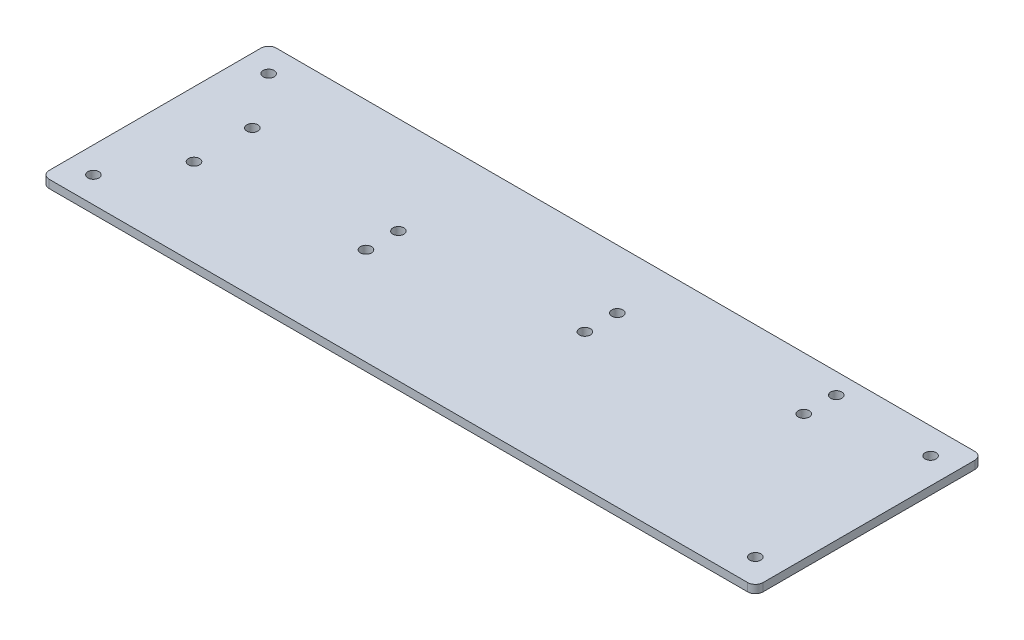
ISO-10303-21;
HEADER;
FILE_DESCRIPTION(('STEP AP214'),'2;1');
FILE_NAME('part.step','',(''),(''),'','','');
FILE_SCHEMA(('AUTOMOTIVE_DESIGN { 1 0 10303 214 1 1 1 1 }'));
ENDSEC;
DATA;
#1=APPLICATION_CONTEXT('core data for automotive mechanical design processes');
#2=APPLICATION_PROTOCOL_DEFINITION('international standard','automotive_design',2000,#1);
#3=PRODUCT_CONTEXT('',#1,'mechanical');
#4=PRODUCT('Part','Part','',(#3));
#5=PRODUCT_RELATED_PRODUCT_CATEGORY('part','',(#4));
#6=PRODUCT_DEFINITION_FORMATION('','',#4);
#7=PRODUCT_DEFINITION_CONTEXT('part definition',#1,'design');
#8=PRODUCT_DEFINITION('design','',#6,#7);
#9=PRODUCT_DEFINITION_SHAPE('','',#8);
#10=(LENGTH_UNIT() NAMED_UNIT(*) SI_UNIT(.MILLI.,.METRE.));
#11=(NAMED_UNIT(*) PLANE_ANGLE_UNIT() SI_UNIT($,.RADIAN.));
#12=(NAMED_UNIT(*) SI_UNIT($,.STERADIAN.) SOLID_ANGLE_UNIT());
#13=UNCERTAINTY_MEASURE_WITH_UNIT(LENGTH_MEASURE(1.E-05),#10,'distance_accuracy_value','');
#14=(GEOMETRIC_REPRESENTATION_CONTEXT(3) GLOBAL_UNCERTAINTY_ASSIGNED_CONTEXT((#13)) GLOBAL_UNIT_ASSIGNED_CONTEXT((#10,
#11,#12)) REPRESENTATION_CONTEXT('',''));
#15=CARTESIAN_POINT('',(0.,0.,0.));
#16=DIRECTION('',(0.,0.,1.));
#17=DIRECTION('',(1.,0.,0.));
#18=AXIS2_PLACEMENT_3D('',#15,#16,#17);
#19=CARTESIAN_POINT('',(139.7,3.175,-44.45));
#20=DIRECTION('',(-1.,0.,0.));
#21=DIRECTION('',(0.,0.,1.));
#22=AXIS2_PLACEMENT_3D('',#19,#20,#21);
#23=PLANE('',#22);
#24=DIRECTION('',(0.,0.,-1.));
#25=VECTOR('',#24,1.);
#26=CARTESIAN_POINT('',(139.7,3.175,-44.45));
#27=LINE('',#26,#25);
#28=CARTESIAN_POINT('',(139.7,3.175,41.45));
#29=VERTEX_POINT('',#28);
#30=CARTESIAN_POINT('',(139.7,3.175,-41.45));
#31=VERTEX_POINT('',#30);
#32=EDGE_CURVE('E130',#29,#31,#27,.T.);
#33=ORIENTED_EDGE('',*,*,#32,.F.);
#34=DIRECTION('',(0.,-1.,0.));
#35=VECTOR('',#34,1.);
#36=CARTESIAN_POINT('',(139.7,3.175,41.45));
#37=LINE('',#36,#35);
#38=CARTESIAN_POINT('',(139.7,0.,41.45));
#39=VERTEX_POINT('',#38);
#40=EDGE_CURVE('E11',#29,#39,#37,.T.);
#41=ORIENTED_EDGE('',*,*,#40,.T.);
#42=DIRECTION('',(0.,0.,-1.));
#43=VECTOR('',#42,1.);
#44=CARTESIAN_POINT('',(139.7,0.,-44.45));
#45=LINE('',#44,#43);
#46=CARTESIAN_POINT('',(139.7,0.,-41.45));
#47=VERTEX_POINT('',#46);
#48=EDGE_CURVE('E132',#39,#47,#45,.T.);
#49=ORIENTED_EDGE('',*,*,#48,.T.);
#50=DIRECTION('',(0.,-1.,0.));
#51=VECTOR('',#50,1.);
#52=CARTESIAN_POINT('',(139.7,3.175,-41.45));
#53=LINE('',#52,#51);
#54=EDGE_CURVE('E43',#47,#31,#53,.F.);
#55=ORIENTED_EDGE('',*,*,#54,.T.);
#56=EDGE_LOOP('',(#33,#41,#49,#55));
#57=FACE_BOUND('',#56,.T.);
#58=ADVANCED_FACE('F35',(#57),#23,.F.);
#59=CARTESIAN_POINT('',(-139.7,3.175,-44.45));
#60=DIRECTION('',(0.,0.,1.));
#61=DIRECTION('',(1.,0.,0.));
#62=AXIS2_PLACEMENT_3D('',#59,#60,#61);
#63=PLANE('',#62);
#64=DIRECTION('',(-1.,0.,0.));
#65=VECTOR('',#64,1.);
#66=CARTESIAN_POINT('',(-139.7,0.,-44.45));
#67=LINE('',#66,#65);
#68=CARTESIAN_POINT('',(136.7,0.,-44.45));
#69=VERTEX_POINT('',#68);
#70=CARTESIAN_POINT('',(-136.7,0.,-44.45));
#71=VERTEX_POINT('',#70);
#72=EDGE_CURVE('E128',#69,#71,#67,.T.);
#73=ORIENTED_EDGE('',*,*,#72,.T.);
#74=DIRECTION('',(0.,-1.,0.));
#75=VECTOR('',#74,1.);
#76=CARTESIAN_POINT('',(-136.7,3.175,-44.45));
#77=LINE('',#76,#75);
#78=CARTESIAN_POINT('',(-136.7,3.175,-44.45));
#79=VERTEX_POINT('',#78);
#80=EDGE_CURVE('E107',#71,#79,#77,.F.);
#81=ORIENTED_EDGE('',*,*,#80,.T.);
#82=DIRECTION('',(-1.,0.,0.));
#83=VECTOR('',#82,1.);
#84=CARTESIAN_POINT('',(-139.7,3.175,-44.45));
#85=LINE('',#84,#83);
#86=CARTESIAN_POINT('',(136.7,3.175,-44.45));
#87=VERTEX_POINT('',#86);
#88=EDGE_CURVE('E216',#87,#79,#85,.T.);
#89=ORIENTED_EDGE('',*,*,#88,.F.);
#90=DIRECTION('',(0.,-1.,0.));
#91=VECTOR('',#90,1.);
#92=CARTESIAN_POINT('',(136.7,3.175,-44.45));
#93=LINE('',#92,#91);
#94=EDGE_CURVE('E112',#87,#69,#93,.T.);
#95=ORIENTED_EDGE('',*,*,#94,.T.);
#96=EDGE_LOOP('',(#73,#81,#89,#95));
#97=FACE_BOUND('',#96,.T.);
#98=ADVANCED_FACE('F220',(#97),#63,.F.);
#99=CARTESIAN_POINT('',(-139.7,3.175,-44.45));
#100=DIRECTION('',(1.,0.,0.));
#101=DIRECTION('',(0.,0.,-1.));
#102=AXIS2_PLACEMENT_3D('',#99,#100,#101);
#103=PLANE('',#102);
#104=DIRECTION('',(0.,0.,1.));
#105=VECTOR('',#104,1.);
#106=CARTESIAN_POINT('',(-139.7,3.175,-44.45));
#107=LINE('',#106,#105);
#108=CARTESIAN_POINT('',(-139.7,3.175,-41.45));
#109=VERTEX_POINT('',#108);
#110=CARTESIAN_POINT('',(-139.7,3.175,41.45));
#111=VERTEX_POINT('',#110);
#112=EDGE_CURVE('E121',#109,#111,#107,.T.);
#113=ORIENTED_EDGE('',*,*,#112,.F.);
#114=DIRECTION('',(0.,-1.,0.));
#115=VECTOR('',#114,1.);
#116=CARTESIAN_POINT('',(-139.7,3.175,-41.45));
#117=LINE('',#116,#115);
#118=CARTESIAN_POINT('',(-139.7,0.,-41.45));
#119=VERTEX_POINT('',#118);
#120=EDGE_CURVE('E106',#109,#119,#117,.T.);
#121=ORIENTED_EDGE('',*,*,#120,.T.);
#122=DIRECTION('',(0.,0.,1.));
#123=VECTOR('',#122,1.);
#124=CARTESIAN_POINT('',(-139.7,0.,-44.45));
#125=LINE('',#124,#123);
#126=CARTESIAN_POINT('',(-139.7,0.,41.45));
#127=VERTEX_POINT('',#126);
#128=EDGE_CURVE('E119',#119,#127,#125,.T.);
#129=ORIENTED_EDGE('',*,*,#128,.T.);
#130=DIRECTION('',(0.,-1.,0.));
#131=VECTOR('',#130,1.);
#132=CARTESIAN_POINT('',(-139.7,3.175,41.45));
#133=LINE('',#132,#131);
#134=EDGE_CURVE('E123',#127,#111,#133,.F.);
#135=ORIENTED_EDGE('',*,*,#134,.T.);
#136=EDGE_LOOP('',(#113,#121,#129,#135));
#137=FACE_BOUND('',#136,.T.);
#138=ADVANCED_FACE('F118',(#137),#103,.F.);
#139=CARTESIAN_POINT('',(-139.7,3.175,44.45));
#140=DIRECTION('',(0.,0.,-1.));
#141=DIRECTION('',(-1.,0.,0.));
#142=AXIS2_PLACEMENT_3D('',#139,#140,#141);
#143=PLANE('',#142);
#144=DIRECTION('',(1.,0.,0.));
#145=VECTOR('',#144,1.);
#146=CARTESIAN_POINT('',(-139.7,3.175,44.45));
#147=LINE('',#146,#145);
#148=CARTESIAN_POINT('',(-136.7,3.175,44.45));
#149=VERTEX_POINT('',#148);
#150=CARTESIAN_POINT('',(136.7,3.175,44.45));
#151=VERTEX_POINT('',#150);
#152=EDGE_CURVE('E184',#149,#151,#147,.T.);
#153=ORIENTED_EDGE('',*,*,#152,.F.);
#154=DIRECTION('',(0.,-1.,0.));
#155=VECTOR('',#154,1.);
#156=CARTESIAN_POINT('',(-136.7,3.175,44.45));
#157=LINE('',#156,#155);
#158=CARTESIAN_POINT('',(-136.7,0.,44.45));
#159=VERTEX_POINT('',#158);
#160=EDGE_CURVE('E201',#149,#159,#157,.T.);
#161=ORIENTED_EDGE('',*,*,#160,.T.);
#162=DIRECTION('',(1.,0.,0.));
#163=VECTOR('',#162,1.);
#164=CARTESIAN_POINT('',(-139.7,0.,44.45));
#165=LINE('',#164,#163);
#166=CARTESIAN_POINT('',(136.7,0.,44.45));
#167=VERTEX_POINT('',#166);
#168=EDGE_CURVE('E127',#159,#167,#165,.T.);
#169=ORIENTED_EDGE('',*,*,#168,.T.);
#170=DIRECTION('',(0.,-1.,0.));
#171=VECTOR('',#170,1.);
#172=CARTESIAN_POINT('',(136.7,3.175,44.45));
#173=LINE('',#172,#171);
#174=EDGE_CURVE('E50',#167,#151,#173,.F.);
#175=ORIENTED_EDGE('',*,*,#174,.T.);
#176=EDGE_LOOP('',(#153,#161,#169,#175));
#177=FACE_BOUND('',#176,.T.);
#178=ADVANCED_FACE('F255',(#177),#143,.F.);
#179=CARTESIAN_POINT('',(0.,3.175,0.));
#180=DIRECTION('',(0.,1.,0.));
#181=DIRECTION('',(0.,0.,1.));
#182=AXIS2_PLACEMENT_3D('',#179,#180,#181);
#183=PLANE('',#182);
#184=CARTESIAN_POINT('',(129.54,3.175,-34.29));
#185=DIRECTION('',(0.,1.,0.));
#186=DIRECTION('',(0.,0.,-1.));
#187=AXIS2_PLACEMENT_3D('',#184,#185,#186);
#188=CIRCLE('',#187,2.15899999999999);
#189=CARTESIAN_POINT('',(129.54,3.175,-36.449));
#190=VERTEX_POINT('',#189);
#191=EDGE_CURVE('E183',#190,#190,#188,.T.);
#192=ORIENTED_EDGE('',*,*,#191,.F.);
#193=EDGE_LOOP('',(#192));
#194=FACE_BOUND('',#193,.T.);
#195=CARTESIAN_POINT('',(-129.54,3.175,-34.29));
#196=DIRECTION('',(0.,1.,0.));
#197=DIRECTION('',(0.,0.,1.));
#198=AXIS2_PLACEMENT_3D('',#195,#196,#197);
#199=CIRCLE('',#198,2.15899999999999);
#200=CARTESIAN_POINT('',(-129.54,3.175,-32.131));
#201=VERTEX_POINT('',#200);
#202=EDGE_CURVE('E179',#201,#201,#199,.T.);
#203=ORIENTED_EDGE('',*,*,#202,.F.);
#204=EDGE_LOOP('',(#203));
#205=FACE_BOUND('',#204,.T.);
#206=CARTESIAN_POINT('',(-129.54,3.175,34.29));
#207=DIRECTION('',(0.,1.,0.));
#208=DIRECTION('',(0.,0.,-1.));
#209=AXIS2_PLACEMENT_3D('',#206,#207,#208);
#210=CIRCLE('',#209,2.15899999999999);
#211=CARTESIAN_POINT('',(-129.54,3.175,32.131));
#212=VERTEX_POINT('',#211);
#213=EDGE_CURVE('E175',#212,#212,#210,.T.);
#214=ORIENTED_EDGE('',*,*,#213,.F.);
#215=EDGE_LOOP('',(#214));
#216=FACE_BOUND('',#215,.T.);
#217=CARTESIAN_POINT('',(129.54,3.175,34.29));
#218=DIRECTION('',(0.,1.,0.));
#219=DIRECTION('',(0.,0.,1.));
#220=AXIS2_PLACEMENT_3D('',#217,#218,#219);
#221=CIRCLE('',#220,2.15899999999999);
#222=CARTESIAN_POINT('',(129.54,3.175,36.449));
#223=VERTEX_POINT('',#222);
#224=EDGE_CURVE('E171',#223,#223,#221,.T.);
#225=ORIENTED_EDGE('',*,*,#224,.F.);
#226=EDGE_LOOP('',(#225));
#227=FACE_BOUND('',#226,.T.);
#228=CARTESIAN_POINT('',(90.5032024020057,3.175,-23.6849228555336));
#229=DIRECTION('',(0.,1.,0.));
#230=DIRECTION('',(0.,0.,1.));
#231=AXIS2_PLACEMENT_3D('',#228,#229,#230);
#232=CIRCLE('',#231,2.15899999999999);
#233=CARTESIAN_POINT('',(90.5032024020057,3.175,-21.5259228555336));
#234=VERTEX_POINT('',#233);
#235=EDGE_CURVE('E167',#234,#234,#232,.T.);
#236=ORIENTED_EDGE('',*,*,#235,.F.);
#237=EDGE_LOOP('',(#236));
#238=FACE_BOUND('',#237,.T.);
#239=CARTESIAN_POINT('',(90.5032024020056,3.175,-36.3849228555336));
#240=DIRECTION('',(0.,1.,0.));
#241=DIRECTION('',(0.,0.,1.));
#242=AXIS2_PLACEMENT_3D('',#239,#240,#241);
#243=CIRCLE('',#242,2.15899999999998);
#244=CARTESIAN_POINT('',(90.5032024020056,3.175,-34.2259228555336));
#245=VERTEX_POINT('',#244);
#246=EDGE_CURVE('E163',#245,#245,#243,.T.);
#247=ORIENTED_EDGE('',*,*,#246,.F.);
#248=EDGE_LOOP('',(#247));
#249=FACE_BOUND('',#248,.T.);
#250=CARTESIAN_POINT('',(19.8516012010029,3.175,-8.66746142776678));
#251=DIRECTION('',(0.,1.,0.));
#252=DIRECTION('',(0.,0.,1.));
#253=AXIS2_PLACEMENT_3D('',#250,#251,#252);
#254=CIRCLE('',#253,2.159);
#255=CARTESIAN_POINT('',(19.8516012010029,3.175,-6.50846142776678));
#256=VERTEX_POINT('',#255);
#257=EDGE_CURVE('E159',#256,#256,#254,.T.);
#258=ORIENTED_EDGE('',*,*,#257,.F.);
#259=EDGE_LOOP('',(#258));
#260=FACE_BOUND('',#259,.T.);
#261=CARTESIAN_POINT('',(19.8516012010028,3.175,-21.3674614277668));
#262=DIRECTION('',(0.,1.,0.));
#263=DIRECTION('',(0.,0.,1.));
#264=AXIS2_PLACEMENT_3D('',#261,#262,#263);
#265=CIRCLE('',#264,2.159);
#266=CARTESIAN_POINT('',(19.8516012010028,3.175,-19.2084614277668));
#267=VERTEX_POINT('',#266);
#268=EDGE_CURVE('E155',#267,#267,#265,.T.);
#269=ORIENTED_EDGE('',*,*,#268,.F.);
#270=EDGE_LOOP('',(#269));
#271=FACE_BOUND('',#270,.T.);
#272=CARTESIAN_POINT('',(-50.7999999999998,3.175,6.35));
#273=DIRECTION('',(0.,1.,0.));
#274=DIRECTION('',(0.,0.,1.));
#275=AXIS2_PLACEMENT_3D('',#272,#273,#274);
#276=CIRCLE('',#275,2.15899999999999);
#277=CARTESIAN_POINT('',(-50.7999999999998,3.175,8.509));
#278=VERTEX_POINT('',#277);
#279=EDGE_CURVE('E151',#278,#278,#276,.T.);
#280=ORIENTED_EDGE('',*,*,#279,.F.);
#281=EDGE_LOOP('',(#280));
#282=FACE_BOUND('',#281,.T.);
#283=CARTESIAN_POINT('',(-50.8,3.175,-6.35));
#284=DIRECTION('',(0.,1.,0.));
#285=DIRECTION('',(0.,0.,1.));
#286=AXIS2_PLACEMENT_3D('',#283,#284,#285);
#287=CIRCLE('',#286,2.159);
#288=CARTESIAN_POINT('',(-50.8,3.175,-4.191));
#289=VERTEX_POINT('',#288);
#290=EDGE_CURVE('E147',#289,#289,#287,.T.);
#291=ORIENTED_EDGE('',*,*,#290,.F.);
#292=EDGE_LOOP('',(#291));
#293=FACE_BOUND('',#292,.T.);
#294=CARTESIAN_POINT('',(-114.3,3.175,10.16));
#295=DIRECTION('',(0.,1.,0.));
#296=DIRECTION('',(0.,0.,1.));
#297=AXIS2_PLACEMENT_3D('',#294,#295,#296);
#298=CIRCLE('',#297,2.16000000000001);
#299=CARTESIAN_POINT('',(-114.3,3.175,12.32));
#300=VERTEX_POINT('',#299);
#301=EDGE_CURVE('E143',#300,#300,#298,.T.);
#302=ORIENTED_EDGE('',*,*,#301,.F.);
#303=EDGE_LOOP('',(#302));
#304=FACE_BOUND('',#303,.T.);
#305=CARTESIAN_POINT('',(-114.3,3.175,-12.7));
#306=DIRECTION('',(0.,1.,0.));
#307=DIRECTION('',(0.,0.,1.));
#308=AXIS2_PLACEMENT_3D('',#305,#306,#307);
#309=CIRCLE('',#308,2.16000000000001);
#310=CARTESIAN_POINT('',(-114.3,3.175,-10.54));
#311=VERTEX_POINT('',#310);
#312=EDGE_CURVE('E139',#311,#311,#309,.T.);
#313=ORIENTED_EDGE('',*,*,#312,.F.);
#314=EDGE_LOOP('',(#313));
#315=FACE_BOUND('',#314,.T.);
#316=ORIENTED_EDGE('',*,*,#88,.T.);
#317=CARTESIAN_POINT('',(-136.7,3.175,-41.45));
#318=DIRECTION('',(0.,1.,0.));
#319=DIRECTION('',(0.,0.,1.));
#320=AXIS2_PLACEMENT_3D('',#317,#318,#319);
#321=CIRCLE('',#320,3.);
#322=EDGE_CURVE('E198',#79,#109,#321,.T.);
#323=ORIENTED_EDGE('',*,*,#322,.T.);
#324=ORIENTED_EDGE('',*,*,#112,.T.);
#325=CARTESIAN_POINT('',(-136.7,3.175,41.45));
#326=DIRECTION('',(0.,1.,0.));
#327=DIRECTION('',(0.,0.,1.));
#328=AXIS2_PLACEMENT_3D('',#325,#326,#327);
#329=CIRCLE('',#328,3.);
#330=EDGE_CURVE('E57',#111,#149,#329,.T.);
#331=ORIENTED_EDGE('',*,*,#330,.T.);
#332=ORIENTED_EDGE('',*,*,#152,.T.);
#333=CARTESIAN_POINT('',(136.7,3.175,41.45));
#334=DIRECTION('',(0.,1.,0.));
#335=DIRECTION('',(0.,0.,1.));
#336=AXIS2_PLACEMENT_3D('',#333,#334,#335);
#337=CIRCLE('',#336,3.);
#338=EDGE_CURVE('E195',#151,#29,#337,.T.);
#339=ORIENTED_EDGE('',*,*,#338,.T.);
#340=ORIENTED_EDGE('',*,*,#32,.T.);
#341=CARTESIAN_POINT('',(136.7,3.175,-41.45));
#342=DIRECTION('',(0.,1.,0.));
#343=DIRECTION('',(0.,0.,1.));
#344=AXIS2_PLACEMENT_3D('',#341,#342,#343);
#345=CIRCLE('',#344,3.);
#346=EDGE_CURVE('E193',#31,#87,#345,.T.);
#347=ORIENTED_EDGE('',*,*,#346,.T.);
#348=EDGE_LOOP('',(#316,#323,#324,#331,#332,#339,#340,#347));
#349=FACE_BOUND('',#348,.T.);
#350=ADVANCED_FACE('F213',(#194,#205,#216,#227,#238,#249,#260,#271,#282,#293,#304,#315,#349),
#183,.T.);
#351=CARTESIAN_POINT('',(0.,0.,0.));
#352=DIRECTION('',(0.,1.,0.));
#353=DIRECTION('',(0.,0.,1.));
#354=AXIS2_PLACEMENT_3D('',#351,#352,#353);
#355=PLANE('',#354);
#356=CARTESIAN_POINT('',(129.54,0.,-34.29));
#357=DIRECTION('',(0.,1.,0.));
#358=DIRECTION('',(0.,0.,1.));
#359=AXIS2_PLACEMENT_3D('',#356,#357,#358);
#360=CIRCLE('',#359,2.15899999999999);
#361=CARTESIAN_POINT('',(129.54,0.,-32.131));
#362=VERTEX_POINT('',#361);
#363=EDGE_CURVE('E180',#362,#362,#360,.T.);
#364=ORIENTED_EDGE('',*,*,#363,.T.);
#365=EDGE_LOOP('',(#364));
#366=FACE_BOUND('',#365,.T.);
#367=CARTESIAN_POINT('',(-129.54,0.,-34.29));
#368=DIRECTION('',(0.,1.,0.));
#369=DIRECTION('',(0.,0.,1.));
#370=AXIS2_PLACEMENT_3D('',#367,#368,#369);
#371=CIRCLE('',#370,2.15899999999999);
#372=CARTESIAN_POINT('',(-129.54,0.,-32.131));
#373=VERTEX_POINT('',#372);
#374=EDGE_CURVE('E176',#373,#373,#371,.T.);
#375=ORIENTED_EDGE('',*,*,#374,.T.);
#376=EDGE_LOOP('',(#375));
#377=FACE_BOUND('',#376,.T.);
#378=CARTESIAN_POINT('',(-129.54,0.,34.29));
#379=DIRECTION('',(0.,1.,0.));
#380=DIRECTION('',(0.,0.,1.));
#381=AXIS2_PLACEMENT_3D('',#378,#379,#380);
#382=CIRCLE('',#381,2.15899999999999);
#383=CARTESIAN_POINT('',(-129.54,0.,36.449));
#384=VERTEX_POINT('',#383);
#385=EDGE_CURVE('E172',#384,#384,#382,.T.);
#386=ORIENTED_EDGE('',*,*,#385,.T.);
#387=EDGE_LOOP('',(#386));
#388=FACE_BOUND('',#387,.T.);
#389=CARTESIAN_POINT('',(129.54,0.,34.29));
#390=DIRECTION('',(0.,1.,0.));
#391=DIRECTION('',(0.,0.,1.));
#392=AXIS2_PLACEMENT_3D('',#389,#390,#391);
#393=CIRCLE('',#392,2.15899999999999);
#394=CARTESIAN_POINT('',(129.54,0.,36.449));
#395=VERTEX_POINT('',#394);
#396=EDGE_CURVE('E168',#395,#395,#393,.T.);
#397=ORIENTED_EDGE('',*,*,#396,.T.);
#398=EDGE_LOOP('',(#397));
#399=FACE_BOUND('',#398,.T.);
#400=CARTESIAN_POINT('',(90.5032024020057,0.,-23.6849228555336));
#401=DIRECTION('',(0.,1.,0.));
#402=DIRECTION('',(0.,0.,1.));
#403=AXIS2_PLACEMENT_3D('',#400,#401,#402);
#404=CIRCLE('',#403,2.15899999999999);
#405=CARTESIAN_POINT('',(90.5032024020057,0.,-21.5259228555336));
#406=VERTEX_POINT('',#405);
#407=EDGE_CURVE('E164',#406,#406,#404,.T.);
#408=ORIENTED_EDGE('',*,*,#407,.T.);
#409=EDGE_LOOP('',(#408));
#410=FACE_BOUND('',#409,.T.);
#411=CARTESIAN_POINT('',(90.5032024020056,0.,-36.3849228555336));
#412=DIRECTION('',(0.,1.,0.));
#413=DIRECTION('',(0.,0.,1.));
#414=AXIS2_PLACEMENT_3D('',#411,#412,#413);
#415=CIRCLE('',#414,2.15899999999998);
#416=CARTESIAN_POINT('',(90.5032024020056,0.,-34.2259228555336));
#417=VERTEX_POINT('',#416);
#418=EDGE_CURVE('E160',#417,#417,#415,.T.);
#419=ORIENTED_EDGE('',*,*,#418,.T.);
#420=EDGE_LOOP('',(#419));
#421=FACE_BOUND('',#420,.T.);
#422=CARTESIAN_POINT('',(19.8516012010029,0.,-8.66746142776678));
#423=DIRECTION('',(0.,1.,0.));
#424=DIRECTION('',(0.,0.,1.));
#425=AXIS2_PLACEMENT_3D('',#422,#423,#424);
#426=CIRCLE('',#425,2.159);
#427=CARTESIAN_POINT('',(19.8516012010029,0.,-6.50846142776678));
#428=VERTEX_POINT('',#427);
#429=EDGE_CURVE('E156',#428,#428,#426,.T.);
#430=ORIENTED_EDGE('',*,*,#429,.T.);
#431=EDGE_LOOP('',(#430));
#432=FACE_BOUND('',#431,.T.);
#433=CARTESIAN_POINT('',(19.8516012010028,0.,-21.3674614277668));
#434=DIRECTION('',(0.,1.,0.));
#435=DIRECTION('',(0.,0.,1.));
#436=AXIS2_PLACEMENT_3D('',#433,#434,#435);
#437=CIRCLE('',#436,2.159);
#438=CARTESIAN_POINT('',(19.8516012010028,0.,-19.2084614277668));
#439=VERTEX_POINT('',#438);
#440=EDGE_CURVE('E152',#439,#439,#437,.T.);
#441=ORIENTED_EDGE('',*,*,#440,.T.);
#442=EDGE_LOOP('',(#441));
#443=FACE_BOUND('',#442,.T.);
#444=CARTESIAN_POINT('',(-50.7999999999998,0.,6.35));
#445=DIRECTION('',(0.,1.,0.));
#446=DIRECTION('',(0.,0.,1.));
#447=AXIS2_PLACEMENT_3D('',#444,#445,#446);
#448=CIRCLE('',#447,2.15899999999999);
#449=CARTESIAN_POINT('',(-50.7999999999998,0.,8.509));
#450=VERTEX_POINT('',#449);
#451=EDGE_CURVE('E148',#450,#450,#448,.T.);
#452=ORIENTED_EDGE('',*,*,#451,.T.);
#453=EDGE_LOOP('',(#452));
#454=FACE_BOUND('',#453,.T.);
#455=CARTESIAN_POINT('',(-50.8,0.,-6.35));
#456=DIRECTION('',(0.,1.,0.));
#457=DIRECTION('',(0.,0.,1.));
#458=AXIS2_PLACEMENT_3D('',#455,#456,#457);
#459=CIRCLE('',#458,2.159);
#460=CARTESIAN_POINT('',(-50.8,0.,-4.191));
#461=VERTEX_POINT('',#460);
#462=EDGE_CURVE('E144',#461,#461,#459,.T.);
#463=ORIENTED_EDGE('',*,*,#462,.T.);
#464=EDGE_LOOP('',(#463));
#465=FACE_BOUND('',#464,.T.);
#466=CARTESIAN_POINT('',(-114.3,0.,10.16));
#467=DIRECTION('',(0.,1.,0.));
#468=DIRECTION('',(0.,0.,1.));
#469=AXIS2_PLACEMENT_3D('',#466,#467,#468);
#470=CIRCLE('',#469,2.16000000000001);
#471=CARTESIAN_POINT('',(-114.3,0.,12.32));
#472=VERTEX_POINT('',#471);
#473=EDGE_CURVE('E140',#472,#472,#470,.T.);
#474=ORIENTED_EDGE('',*,*,#473,.T.);
#475=EDGE_LOOP('',(#474));
#476=FACE_BOUND('',#475,.T.);
#477=CARTESIAN_POINT('',(-114.3,0.,-12.7));
#478=DIRECTION('',(0.,1.,0.));
#479=DIRECTION('',(0.,0.,1.));
#480=AXIS2_PLACEMENT_3D('',#477,#478,#479);
#481=CIRCLE('',#480,2.16000000000001);
#482=CARTESIAN_POINT('',(-114.3,0.,-10.54));
#483=VERTEX_POINT('',#482);
#484=EDGE_CURVE('E136',#483,#483,#481,.T.);
#485=ORIENTED_EDGE('',*,*,#484,.T.);
#486=EDGE_LOOP('',(#485));
#487=FACE_BOUND('',#486,.T.);
#488=ORIENTED_EDGE('',*,*,#128,.F.);
#489=CARTESIAN_POINT('',(-136.7,0.,-41.45));
#490=DIRECTION('',(0.,1.,0.));
#491=DIRECTION('',(0.,0.,1.));
#492=AXIS2_PLACEMENT_3D('',#489,#490,#491);
#493=CIRCLE('',#492,3.);
#494=EDGE_CURVE('E102',#119,#71,#493,.F.);
#495=ORIENTED_EDGE('',*,*,#494,.T.);
#496=ORIENTED_EDGE('',*,*,#72,.F.);
#497=CARTESIAN_POINT('',(136.7,0.,-41.45));
#498=DIRECTION('',(0.,1.,0.));
#499=DIRECTION('',(0.,0.,1.));
#500=AXIS2_PLACEMENT_3D('',#497,#498,#499);
#501=CIRCLE('',#500,3.);
#502=EDGE_CURVE('E122',#69,#47,#501,.F.);
#503=ORIENTED_EDGE('',*,*,#502,.T.);
#504=ORIENTED_EDGE('',*,*,#48,.F.);
#505=CARTESIAN_POINT('',(136.7,0.,41.45));
#506=DIRECTION('',(0.,1.,0.));
#507=DIRECTION('',(0.,0.,1.));
#508=AXIS2_PLACEMENT_3D('',#505,#506,#507);
#509=CIRCLE('',#508,3.);
#510=EDGE_CURVE('E187',#39,#167,#509,.F.);
#511=ORIENTED_EDGE('',*,*,#510,.T.);
#512=ORIENTED_EDGE('',*,*,#168,.F.);
#513=CARTESIAN_POINT('',(-136.7,0.,41.45));
#514=DIRECTION('',(0.,1.,0.));
#515=DIRECTION('',(0.,0.,1.));
#516=AXIS2_PLACEMENT_3D('',#513,#514,#515);
#517=CIRCLE('',#516,3.);
#518=EDGE_CURVE('E113',#159,#127,#517,.F.);
#519=ORIENTED_EDGE('',*,*,#518,.T.);
#520=EDGE_LOOP('',(#488,#495,#496,#503,#504,#511,#512,#519));
#521=FACE_BOUND('',#520,.T.);
#522=ADVANCED_FACE('F125',(#366,#377,#388,#399,#410,#421,#432,#443,#454,#465,#476,#487,#521),
#355,.F.);
#523=CARTESIAN_POINT('',(-114.3,-3.175,-12.7));
#524=DIRECTION('',(0.,1.,0.));
#525=DIRECTION('',(0.,0.,1.));
#526=AXIS2_PLACEMENT_3D('',#523,#524,#525);
#527=CYLINDRICAL_SURFACE('',#526,2.16000000000001);
#528=ORIENTED_EDGE('',*,*,#312,.T.);
#529=EDGE_LOOP('',(#528));
#530=FACE_BOUND('',#529,.T.);
#531=ORIENTED_EDGE('',*,*,#484,.F.);
#532=EDGE_LOOP('',(#531));
#533=FACE_BOUND('',#532,.T.);
#534=ADVANCED_FACE('F279',(#530,#533),#527,.F.);
#535=CARTESIAN_POINT('',(-114.3,-3.175,10.16));
#536=DIRECTION('',(0.,1.,0.));
#537=DIRECTION('',(0.,0.,1.));
#538=AXIS2_PLACEMENT_3D('',#535,#536,#537);
#539=CYLINDRICAL_SURFACE('',#538,2.16000000000001);
#540=ORIENTED_EDGE('',*,*,#301,.T.);
#541=EDGE_LOOP('',(#540));
#542=FACE_BOUND('',#541,.T.);
#543=ORIENTED_EDGE('',*,*,#473,.F.);
#544=EDGE_LOOP('',(#543));
#545=FACE_BOUND('',#544,.T.);
#546=ADVANCED_FACE('F282',(#542,#545),#539,.F.);
#547=CARTESIAN_POINT('',(-50.8,-3.175,-6.35));
#548=DIRECTION('',(0.,1.,0.));
#549=DIRECTION('',(0.,0.,1.));
#550=AXIS2_PLACEMENT_3D('',#547,#548,#549);
#551=CYLINDRICAL_SURFACE('',#550,2.159);
#552=ORIENTED_EDGE('',*,*,#290,.T.);
#553=EDGE_LOOP('',(#552));
#554=FACE_BOUND('',#553,.T.);
#555=ORIENTED_EDGE('',*,*,#462,.F.);
#556=EDGE_LOOP('',(#555));
#557=FACE_BOUND('',#556,.T.);
#558=ADVANCED_FACE('F453',(#554,#557),#551,.F.);
#559=CARTESIAN_POINT('',(-50.7999999999998,-3.175,6.35));
#560=DIRECTION('',(0.,1.,0.));
#561=DIRECTION('',(0.,0.,1.));
#562=AXIS2_PLACEMENT_3D('',#559,#560,#561);
#563=CYLINDRICAL_SURFACE('',#562,2.15899999999999);
#564=ORIENTED_EDGE('',*,*,#279,.T.);
#565=EDGE_LOOP('',(#564));
#566=FACE_BOUND('',#565,.T.);
#567=ORIENTED_EDGE('',*,*,#451,.F.);
#568=EDGE_LOOP('',(#567));
#569=FACE_BOUND('',#568,.T.);
#570=ADVANCED_FACE('F443',(#566,#569),#563,.F.);
#571=CARTESIAN_POINT('',(19.8516012010028,-3.175,-21.3674614277668));
#572=DIRECTION('',(0.,1.,0.));
#573=DIRECTION('',(0.,0.,1.));
#574=AXIS2_PLACEMENT_3D('',#571,#572,#573);
#575=CYLINDRICAL_SURFACE('',#574,2.159);
#576=ORIENTED_EDGE('',*,*,#268,.T.);
#577=EDGE_LOOP('',(#576));
#578=FACE_BOUND('',#577,.T.);
#579=ORIENTED_EDGE('',*,*,#440,.F.);
#580=EDGE_LOOP('',(#579));
#581=FACE_BOUND('',#580,.T.);
#582=ADVANCED_FACE('F433',(#578,#581),#575,.F.);
#583=CARTESIAN_POINT('',(19.8516012010029,-3.175,-8.66746142776678));
#584=DIRECTION('',(0.,1.,0.));
#585=DIRECTION('',(0.,0.,1.));
#586=AXIS2_PLACEMENT_3D('',#583,#584,#585);
#587=CYLINDRICAL_SURFACE('',#586,2.159);
#588=ORIENTED_EDGE('',*,*,#257,.T.);
#589=EDGE_LOOP('',(#588));
#590=FACE_BOUND('',#589,.T.);
#591=ORIENTED_EDGE('',*,*,#429,.F.);
#592=EDGE_LOOP('',(#591));
#593=FACE_BOUND('',#592,.T.);
#594=ADVANCED_FACE('F423',(#590,#593),#587,.F.);
#595=CARTESIAN_POINT('',(90.5032024020056,-3.175,-36.3849228555336));
#596=DIRECTION('',(0.,1.,0.));
#597=DIRECTION('',(0.,0.,1.));
#598=AXIS2_PLACEMENT_3D('',#595,#596,#597);
#599=CYLINDRICAL_SURFACE('',#598,2.15899999999998);
#600=ORIENTED_EDGE('',*,*,#246,.T.);
#601=EDGE_LOOP('',(#600));
#602=FACE_BOUND('',#601,.T.);
#603=ORIENTED_EDGE('',*,*,#418,.F.);
#604=EDGE_LOOP('',(#603));
#605=FACE_BOUND('',#604,.T.);
#606=ADVANCED_FACE('F413',(#602,#605),#599,.F.);
#607=CARTESIAN_POINT('',(90.5032024020057,-3.175,-23.6849228555336));
#608=DIRECTION('',(0.,1.,0.));
#609=DIRECTION('',(0.,0.,1.));
#610=AXIS2_PLACEMENT_3D('',#607,#608,#609);
#611=CYLINDRICAL_SURFACE('',#610,2.15899999999999);
#612=ORIENTED_EDGE('',*,*,#235,.T.);
#613=EDGE_LOOP('',(#612));
#614=FACE_BOUND('',#613,.T.);
#615=ORIENTED_EDGE('',*,*,#407,.F.);
#616=EDGE_LOOP('',(#615));
#617=FACE_BOUND('',#616,.T.);
#618=ADVANCED_FACE('F403',(#614,#617),#611,.F.);
#619=CARTESIAN_POINT('',(129.54,-3.175,34.29));
#620=DIRECTION('',(0.,1.,0.));
#621=DIRECTION('',(0.,0.,1.));
#622=AXIS2_PLACEMENT_3D('',#619,#620,#621);
#623=CYLINDRICAL_SURFACE('',#622,2.15899999999999);
#624=ORIENTED_EDGE('',*,*,#224,.T.);
#625=EDGE_LOOP('',(#624));
#626=FACE_BOUND('',#625,.T.);
#627=ORIENTED_EDGE('',*,*,#396,.F.);
#628=EDGE_LOOP('',(#627));
#629=FACE_BOUND('',#628,.T.);
#630=ADVANCED_FACE('F393',(#626,#629),#623,.F.);
#631=CARTESIAN_POINT('',(-129.54,-3.175,34.29));
#632=DIRECTION('',(0.,1.,0.));
#633=DIRECTION('',(0.,0.,1.));
#634=AXIS2_PLACEMENT_3D('',#631,#632,#633);
#635=CYLINDRICAL_SURFACE('',#634,2.15899999999999);
#636=ORIENTED_EDGE('',*,*,#213,.T.);
#637=EDGE_LOOP('',(#636));
#638=FACE_BOUND('',#637,.T.);
#639=ORIENTED_EDGE('',*,*,#385,.F.);
#640=EDGE_LOOP('',(#639));
#641=FACE_BOUND('',#640,.T.);
#642=ADVANCED_FACE('F383',(#638,#641),#635,.F.);
#643=CARTESIAN_POINT('',(-129.54,-3.175,-34.29));
#644=DIRECTION('',(0.,1.,0.));
#645=DIRECTION('',(0.,0.,1.));
#646=AXIS2_PLACEMENT_3D('',#643,#644,#645);
#647=CYLINDRICAL_SURFACE('',#646,2.15899999999999);
#648=ORIENTED_EDGE('',*,*,#202,.T.);
#649=EDGE_LOOP('',(#648));
#650=FACE_BOUND('',#649,.T.);
#651=ORIENTED_EDGE('',*,*,#374,.F.);
#652=EDGE_LOOP('',(#651));
#653=FACE_BOUND('',#652,.T.);
#654=ADVANCED_FACE('F374',(#650,#653),#647,.F.);
#655=CARTESIAN_POINT('',(129.54,-3.175,-34.29));
#656=DIRECTION('',(0.,1.,0.));
#657=DIRECTION('',(0.,0.,1.));
#658=AXIS2_PLACEMENT_3D('',#655,#656,#657);
#659=CYLINDRICAL_SURFACE('',#658,2.15899999999999);
#660=ORIENTED_EDGE('',*,*,#191,.T.);
#661=EDGE_LOOP('',(#660));
#662=FACE_BOUND('',#661,.T.);
#663=ORIENTED_EDGE('',*,*,#363,.F.);
#664=EDGE_LOOP('',(#663));
#665=FACE_BOUND('',#664,.T.);
#666=ADVANCED_FACE('F250',(#662,#665),#659,.F.);
#667=CARTESIAN_POINT('',(-136.7,3.175,-41.45));
#668=DIRECTION('',(0.,-1.,0.));
#669=DIRECTION('',(0.,0.,-1.));
#670=AXIS2_PLACEMENT_3D('',#667,#668,#669);
#671=CYLINDRICAL_SURFACE('',#670,3.);
#672=ORIENTED_EDGE('',*,*,#322,.F.);
#673=ORIENTED_EDGE('',*,*,#80,.F.);
#674=ORIENTED_EDGE('',*,*,#494,.F.);
#675=ORIENTED_EDGE('',*,*,#120,.F.);
#676=EDGE_LOOP('',(#672,#673,#674,#675));
#677=FACE_BOUND('',#676,.T.);
#678=ADVANCED_FACE('F105',(#677),#671,.T.);
#679=CARTESIAN_POINT('',(-136.7,3.175,41.45));
#680=DIRECTION('',(0.,-1.,0.));
#681=DIRECTION('',(0.,0.,-1.));
#682=AXIS2_PLACEMENT_3D('',#679,#680,#681);
#683=CYLINDRICAL_SURFACE('',#682,3.);
#684=ORIENTED_EDGE('',*,*,#330,.F.);
#685=ORIENTED_EDGE('',*,*,#134,.F.);
#686=ORIENTED_EDGE('',*,*,#518,.F.);
#687=ORIENTED_EDGE('',*,*,#160,.F.);
#688=EDGE_LOOP('',(#684,#685,#686,#687));
#689=FACE_BOUND('',#688,.T.);
#690=ADVANCED_FACE('F303',(#689),#683,.T.);
#691=CARTESIAN_POINT('',(136.7,3.175,41.45));
#692=DIRECTION('',(0.,-1.,0.));
#693=DIRECTION('',(0.,0.,-1.));
#694=AXIS2_PLACEMENT_3D('',#691,#692,#693);
#695=CYLINDRICAL_SURFACE('',#694,3.);
#696=ORIENTED_EDGE('',*,*,#338,.F.);
#697=ORIENTED_EDGE('',*,*,#174,.F.);
#698=ORIENTED_EDGE('',*,*,#510,.F.);
#699=ORIENTED_EDGE('',*,*,#40,.F.);
#700=EDGE_LOOP('',(#696,#697,#698,#699));
#701=FACE_BOUND('',#700,.T.);
#702=ADVANCED_FACE('F305',(#701),#695,.T.);
#703=CARTESIAN_POINT('',(136.7,3.175,-41.45));
#704=DIRECTION('',(0.,-1.,0.));
#705=DIRECTION('',(0.,0.,-1.));
#706=AXIS2_PLACEMENT_3D('',#703,#704,#705);
#707=CYLINDRICAL_SURFACE('',#706,3.);
#708=ORIENTED_EDGE('',*,*,#346,.F.);
#709=ORIENTED_EDGE('',*,*,#54,.F.);
#710=ORIENTED_EDGE('',*,*,#502,.F.);
#711=ORIENTED_EDGE('',*,*,#94,.F.);
#712=EDGE_LOOP('',(#708,#709,#710,#711));
#713=FACE_BOUND('',#712,.T.);
#714=ADVANCED_FACE('F37',(#713),#707,.T.);
#715=CLOSED_SHELL('',(#58,#98,#138,#178,#350,#522,#534,#546,#558,#570,#582,#594,#606,#618,#630,
#642,#654,#666,#678,#690,#702,#714));
#716=MANIFOLD_SOLID_BREP('B2',#715);
#717=ADVANCED_BREP_SHAPE_REPRESENTATION('',(#18,#716),#14);
#718=SHAPE_DEFINITION_REPRESENTATION(#9,#717);
ENDSEC;
END-ISO-10303-21;
